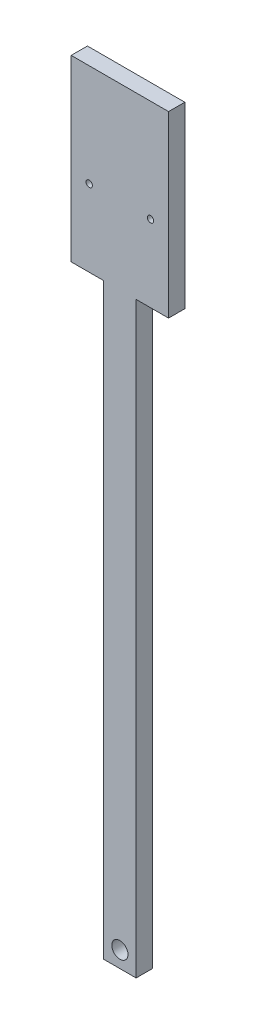
ISO-10303-21;
HEADER;
FILE_DESCRIPTION(('STEP AP214'),'2;1');
FILE_NAME('part.step','',(''),(''),'','','');
FILE_SCHEMA(('AUTOMOTIVE_DESIGN { 1 0 10303 214 1 1 1 1 }'));
ENDSEC;
DATA;
#1=APPLICATION_CONTEXT('core data for automotive mechanical design processes');
#2=APPLICATION_PROTOCOL_DEFINITION('international standard','automotive_design',2000,#1);
#3=PRODUCT_CONTEXT('',#1,'mechanical');
#4=PRODUCT('Part','Part','',(#3));
#5=PRODUCT_RELATED_PRODUCT_CATEGORY('part','',(#4));
#6=PRODUCT_DEFINITION_FORMATION('','',#4);
#7=PRODUCT_DEFINITION_CONTEXT('part definition',#1,'design');
#8=PRODUCT_DEFINITION('design','',#6,#7);
#9=PRODUCT_DEFINITION_SHAPE('','',#8);
#10=(LENGTH_UNIT() NAMED_UNIT(*) SI_UNIT(.MILLI.,.METRE.));
#11=(NAMED_UNIT(*) PLANE_ANGLE_UNIT() SI_UNIT($,.RADIAN.));
#12=(NAMED_UNIT(*) SI_UNIT($,.STERADIAN.) SOLID_ANGLE_UNIT());
#13=UNCERTAINTY_MEASURE_WITH_UNIT(LENGTH_MEASURE(1.E-05),#10,'distance_accuracy_value','');
#14=(GEOMETRIC_REPRESENTATION_CONTEXT(3) GLOBAL_UNCERTAINTY_ASSIGNED_CONTEXT((#13)) GLOBAL_UNIT_ASSIGNED_CONTEXT((#10,
#11,#12)) REPRESENTATION_CONTEXT('',''));
#15=CARTESIAN_POINT('',(0.,0.,0.));
#16=DIRECTION('',(0.,0.,1.));
#17=DIRECTION('',(1.,0.,0.));
#18=AXIS2_PLACEMENT_3D('',#15,#16,#17);
#19=CARTESIAN_POINT('',(6.35,150.,-3.175));
#20=DIRECTION('',(-1.,0.,0.));
#21=DIRECTION('',(0.,0.,1.));
#22=AXIS2_PLACEMENT_3D('',#19,#20,#21);
#23=PLANE('',#22);
#24=DIRECTION('',(0.,0.,-1.));
#25=VECTOR('',#24,1.);
#26=CARTESIAN_POINT('',(6.35,80.,-3.175));
#27=LINE('',#26,#25);
#28=CARTESIAN_POINT('',(6.35,80.,3.175));
#29=VERTEX_POINT('',#28);
#30=CARTESIAN_POINT('',(6.35,80.,-3.175));
#31=VERTEX_POINT('',#30);
#32=EDGE_CURVE('E120',#29,#31,#27,.T.);
#33=ORIENTED_EDGE('',*,*,#32,.F.);
#34=DIRECTION('',(0.,-1.,0.));
#35=VECTOR('',#34,1.);
#36=CARTESIAN_POINT('',(6.35,150.,3.175));
#37=LINE('',#36,#35);
#38=CARTESIAN_POINT('',(6.35,-150.,3.175));
#39=VERTEX_POINT('',#38);
#40=EDGE_CURVE('E49',#29,#39,#37,.T.);
#41=ORIENTED_EDGE('',*,*,#40,.T.);
#42=DIRECTION('',(0.,0.,-1.));
#43=VECTOR('',#42,1.);
#44=CARTESIAN_POINT('',(6.35,-150.,-3.175));
#45=LINE('',#44,#43);
#46=CARTESIAN_POINT('',(6.35,-150.,-3.175));
#47=VERTEX_POINT('',#46);
#48=EDGE_CURVE('E156',#39,#47,#45,.T.);
#49=ORIENTED_EDGE('',*,*,#48,.T.);
#50=DIRECTION('',(0.,-1.,0.));
#51=VECTOR('',#50,1.);
#52=CARTESIAN_POINT('',(6.35,150.,-3.175));
#53=LINE('',#52,#51);
#54=EDGE_CURVE('E11',#31,#47,#53,.T.);
#55=ORIENTED_EDGE('',*,*,#54,.F.);
#56=EDGE_LOOP('',(#33,#41,#49,#55));
#57=FACE_BOUND('',#56,.T.);
#58=ADVANCED_FACE('F35',(#57),#23,.F.);
#59=CARTESIAN_POINT('',(-6.35,150.,-3.175));
#60=DIRECTION('',(1.,0.,0.));
#61=DIRECTION('',(0.,0.,-1.));
#62=AXIS2_PLACEMENT_3D('',#59,#60,#61);
#63=PLANE('',#62);
#64=DIRECTION('',(0.,0.,1.));
#65=VECTOR('',#64,1.);
#66=CARTESIAN_POINT('',(-6.35,80.,-3.175));
#67=LINE('',#66,#65);
#68=CARTESIAN_POINT('',(-6.35,80.,-3.175));
#69=VERTEX_POINT('',#68);
#70=CARTESIAN_POINT('',(-6.35,80.,3.175));
#71=VERTEX_POINT('',#70);
#72=EDGE_CURVE('E143',#69,#71,#67,.T.);
#73=ORIENTED_EDGE('',*,*,#72,.F.);
#74=DIRECTION('',(0.,-1.,0.));
#75=VECTOR('',#74,1.);
#76=CARTESIAN_POINT('',(-6.35,150.,-3.175));
#77=LINE('',#76,#75);
#78=CARTESIAN_POINT('',(-6.35,-150.,-3.175));
#79=VERTEX_POINT('',#78);
#80=EDGE_CURVE('E42',#69,#79,#77,.T.);
#81=ORIENTED_EDGE('',*,*,#80,.T.);
#82=DIRECTION('',(0.,0.,1.));
#83=VECTOR('',#82,1.);
#84=CARTESIAN_POINT('',(-6.35,-150.,-3.175));
#85=LINE('',#84,#83);
#86=CARTESIAN_POINT('',(-6.35,-150.,3.175));
#87=VERTEX_POINT('',#86);
#88=EDGE_CURVE('E165',#79,#87,#85,.T.);
#89=ORIENTED_EDGE('',*,*,#88,.T.);
#90=DIRECTION('',(0.,-1.,0.));
#91=VECTOR('',#90,1.);
#92=CARTESIAN_POINT('',(-6.35,150.,3.175));
#93=LINE('',#92,#91);
#94=EDGE_CURVE('E56',#71,#87,#93,.T.);
#95=ORIENTED_EDGE('',*,*,#94,.F.);
#96=EDGE_LOOP('',(#73,#81,#89,#95));
#97=FACE_BOUND('',#96,.T.);
#98=ADVANCED_FACE('F172',(#97),#63,.F.);
#99=CARTESIAN_POINT('',(-6.35,150.,-3.175));
#100=DIRECTION('',(0.,0.,1.));
#101=DIRECTION('',(1.,0.,0.));
#102=AXIS2_PLACEMENT_3D('',#99,#100,#101);
#103=PLANE('',#102);
#104=CARTESIAN_POINT('',(-11.9999999999999,110.,-3.175));
#105=DIRECTION('',(0.,0.,-1.));
#106=DIRECTION('',(-1.,0.,0.));
#107=AXIS2_PLACEMENT_3D('',#104,#105,#106);
#108=CIRCLE('',#107,1.525);
#109=CARTESIAN_POINT('',(-13.5249999999999,110.,-3.175));
#110=VERTEX_POINT('',#109);
#111=EDGE_CURVE('E238',#110,#110,#108,.T.);
#112=ORIENTED_EDGE('',*,*,#111,.F.);
#113=EDGE_LOOP('',(#112));
#114=FACE_BOUND('',#113,.T.);
#115=CARTESIAN_POINT('',(12.0000000000001,110.,-3.175));
#116=DIRECTION('',(0.,0.,-1.));
#117=DIRECTION('',(-1.,0.,0.));
#118=AXIS2_PLACEMENT_3D('',#115,#116,#117);
#119=CIRCLE('',#118,1.525);
#120=CARTESIAN_POINT('',(10.4750000000001,110.,-3.175));
#121=VERTEX_POINT('',#120);
#122=EDGE_CURVE('E245',#121,#121,#119,.T.);
#123=ORIENTED_EDGE('',*,*,#122,.F.);
#124=EDGE_LOOP('',(#123));
#125=FACE_BOUND('',#124,.T.);
#126=DIRECTION('',(-1.,0.,0.));
#127=VECTOR('',#126,1.);
#128=CARTESIAN_POINT('',(-6.35,150.,-3.175));
#129=LINE('',#128,#127);
#130=CARTESIAN_POINT('',(19.05,150.,-3.175));
#131=VERTEX_POINT('',#130);
#132=CARTESIAN_POINT('',(-19.05,150.,-3.175));
#133=VERTEX_POINT('',#132);
#134=EDGE_CURVE('E108',#131,#133,#129,.T.);
#135=ORIENTED_EDGE('',*,*,#134,.F.);
#136=DIRECTION('',(0.,1.,0.));
#137=VECTOR('',#136,1.);
#138=CARTESIAN_POINT('',(19.05,80.,-3.175));
#139=LINE('',#138,#137);
#140=CARTESIAN_POINT('',(19.05,80.,-3.175));
#141=VERTEX_POINT('',#140);
#142=EDGE_CURVE('E101',#141,#131,#139,.T.);
#143=ORIENTED_EDGE('',*,*,#142,.F.);
#144=DIRECTION('',(-1.,0.,0.));
#145=VECTOR('',#144,1.);
#146=CARTESIAN_POINT('',(-19.05,80.,-3.175));
#147=LINE('',#146,#145);
#148=EDGE_CURVE('E105',#141,#31,#147,.T.);
#149=ORIENTED_EDGE('',*,*,#148,.T.);
#150=ORIENTED_EDGE('',*,*,#54,.T.);
#151=DIRECTION('',(-1.,0.,0.));
#152=VECTOR('',#151,1.);
#153=CARTESIAN_POINT('',(-6.35,-150.,-3.175));
#154=LINE('',#153,#152);
#155=EDGE_CURVE('E162',#47,#79,#154,.T.);
#156=ORIENTED_EDGE('',*,*,#155,.T.);
#157=ORIENTED_EDGE('',*,*,#80,.F.);
#158=CARTESIAN_POINT('',(-19.05,80.,-3.175));
#159=VERTEX_POINT('',#158);
#160=EDGE_CURVE('E122',#69,#159,#147,.T.);
#161=ORIENTED_EDGE('',*,*,#160,.T.);
#162=DIRECTION('',(0.,1.,0.));
#163=VECTOR('',#162,1.);
#164=CARTESIAN_POINT('',(-19.05,80.,-3.175));
#165=LINE('',#164,#163);
#166=EDGE_CURVE('E113',#159,#133,#165,.T.);
#167=ORIENTED_EDGE('',*,*,#166,.T.);
#168=EDGE_LOOP('',(#135,#143,#149,#150,#156,#157,#161,#167));
#169=FACE_BOUND('',#168,.T.);
#170=CARTESIAN_POINT('',(0.,-143.65,-3.175));
#171=DIRECTION('',(0.,0.,1.));
#172=DIRECTION('',(1.,0.,0.));
#173=AXIS2_PLACEMENT_3D('',#170,#171,#172);
#174=CIRCLE('',#173,3.175);
#175=CARTESIAN_POINT('',(3.175,-143.65,-3.175));
#176=VERTEX_POINT('',#175);
#177=EDGE_CURVE('E153',#176,#176,#174,.T.);
#178=ORIENTED_EDGE('',*,*,#177,.T.);
#179=EDGE_LOOP('',(#178));
#180=FACE_BOUND('',#179,.T.);
#181=ADVANCED_FACE('F103',(#114,#125,#169,#180),#103,.F.);
#182=CARTESIAN_POINT('',(-6.35,150.,3.175));
#183=DIRECTION('',(0.,0.,-1.));
#184=DIRECTION('',(-1.,0.,0.));
#185=AXIS2_PLACEMENT_3D('',#182,#183,#184);
#186=PLANE('',#185);
#187=CARTESIAN_POINT('',(-11.9999999999999,110.,3.175));
#188=DIRECTION('',(0.,0.,-1.));
#189=DIRECTION('',(-1.,0.,0.));
#190=AXIS2_PLACEMENT_3D('',#187,#188,#189);
#191=CIRCLE('',#190,1.25);
#192=CARTESIAN_POINT('',(-13.2499999999999,110.,3.175));
#193=VERTEX_POINT('',#192);
#194=EDGE_CURVE('E240',#193,#193,#191,.T.);
#195=ORIENTED_EDGE('',*,*,#194,.T.);
#196=EDGE_LOOP('',(#195));
#197=FACE_BOUND('',#196,.T.);
#198=CARTESIAN_POINT('',(12.0000000000001,110.,3.17500000000001));
#199=DIRECTION('',(0.,0.,-1.));
#200=DIRECTION('',(-1.,0.,0.));
#201=AXIS2_PLACEMENT_3D('',#198,#199,#200);
#202=CIRCLE('',#201,1.25);
#203=CARTESIAN_POINT('',(10.7500000000001,110.,3.17500000000001));
#204=VERTEX_POINT('',#203);
#205=EDGE_CURVE('E134',#204,#204,#202,.T.);
#206=ORIENTED_EDGE('',*,*,#205,.T.);
#207=EDGE_LOOP('',(#206));
#208=FACE_BOUND('',#207,.T.);
#209=DIRECTION('',(1.,0.,0.));
#210=VECTOR('',#209,1.);
#211=CARTESIAN_POINT('',(-6.35,150.,3.175));
#212=LINE('',#211,#210);
#213=CARTESIAN_POINT('',(-19.05,150.,3.175));
#214=VERTEX_POINT('',#213);
#215=CARTESIAN_POINT('',(19.05,150.,3.175));
#216=VERTEX_POINT('',#215);
#217=EDGE_CURVE('E158',#214,#216,#212,.T.);
#218=ORIENTED_EDGE('',*,*,#217,.F.);
#219=DIRECTION('',(0.,1.,0.));
#220=VECTOR('',#219,1.);
#221=CARTESIAN_POINT('',(-19.05,80.,3.175));
#222=LINE('',#221,#220);
#223=CARTESIAN_POINT('',(-19.05,80.,3.175));
#224=VERTEX_POINT('',#223);
#225=EDGE_CURVE('E144',#224,#214,#222,.T.);
#226=ORIENTED_EDGE('',*,*,#225,.F.);
#227=DIRECTION('',(1.,0.,0.));
#228=VECTOR('',#227,1.);
#229=CARTESIAN_POINT('',(-19.05,80.,3.175));
#230=LINE('',#229,#228);
#231=EDGE_CURVE('E114',#224,#71,#230,.T.);
#232=ORIENTED_EDGE('',*,*,#231,.T.);
#233=ORIENTED_EDGE('',*,*,#94,.T.);
#234=DIRECTION('',(1.,0.,0.));
#235=VECTOR('',#234,1.);
#236=CARTESIAN_POINT('',(-6.35,-150.,3.175));
#237=LINE('',#236,#235);
#238=EDGE_CURVE('E159',#87,#39,#237,.T.);
#239=ORIENTED_EDGE('',*,*,#238,.T.);
#240=ORIENTED_EDGE('',*,*,#40,.F.);
#241=CARTESIAN_POINT('',(19.05,80.,3.175));
#242=VERTEX_POINT('',#241);
#243=EDGE_CURVE('E139',#29,#242,#230,.T.);
#244=ORIENTED_EDGE('',*,*,#243,.T.);
#245=DIRECTION('',(0.,1.,0.));
#246=VECTOR('',#245,1.);
#247=CARTESIAN_POINT('',(19.05,80.,3.175));
#248=LINE('',#247,#246);
#249=EDGE_CURVE('E127',#242,#216,#248,.T.);
#250=ORIENTED_EDGE('',*,*,#249,.T.);
#251=EDGE_LOOP('',(#218,#226,#232,#233,#239,#240,#244,#250));
#252=FACE_BOUND('',#251,.T.);
#253=CARTESIAN_POINT('',(0.,-143.65,3.175));
#254=DIRECTION('',(0.,0.,1.));
#255=DIRECTION('',(1.,0.,0.));
#256=AXIS2_PLACEMENT_3D('',#253,#254,#255);
#257=CIRCLE('',#256,3.175);
#258=CARTESIAN_POINT('',(3.175,-143.65,3.175));
#259=VERTEX_POINT('',#258);
#260=EDGE_CURVE('E150',#259,#259,#257,.T.);
#261=ORIENTED_EDGE('',*,*,#260,.F.);
#262=EDGE_LOOP('',(#261));
#263=FACE_BOUND('',#262,.T.);
#264=ADVANCED_FACE('F179',(#197,#208,#252,#263),#186,.F.);
#265=CARTESIAN_POINT('',(0.,150.,0.));
#266=DIRECTION('',(0.,1.,0.));
#267=DIRECTION('',(0.,0.,1.));
#268=AXIS2_PLACEMENT_3D('',#265,#266,#267);
#269=PLANE('',#268);
#270=ORIENTED_EDGE('',*,*,#217,.T.);
#271=DIRECTION('',(0.,0.,-1.));
#272=VECTOR('',#271,1.);
#273=CARTESIAN_POINT('',(19.05,150.,-3.175));
#274=LINE('',#273,#272);
#275=EDGE_CURVE('E131',#216,#131,#274,.T.);
#276=ORIENTED_EDGE('',*,*,#275,.T.);
#277=ORIENTED_EDGE('',*,*,#134,.T.);
#278=DIRECTION('',(0.,0.,1.));
#279=VECTOR('',#278,1.);
#280=CARTESIAN_POINT('',(-19.05,150.,-3.175));
#281=LINE('',#280,#279);
#282=EDGE_CURVE('E128',#133,#214,#281,.T.);
#283=ORIENTED_EDGE('',*,*,#282,.T.);
#284=EDGE_LOOP('',(#270,#276,#277,#283));
#285=FACE_BOUND('',#284,.T.);
#286=ADVANCED_FACE('F195',(#285),#269,.T.);
#287=CARTESIAN_POINT('',(0.,-150.,0.));
#288=DIRECTION('',(0.,1.,0.));
#289=DIRECTION('',(0.,0.,1.));
#290=AXIS2_PLACEMENT_3D('',#287,#288,#289);
#291=PLANE('',#290);
#292=ORIENTED_EDGE('',*,*,#48,.F.);
#293=ORIENTED_EDGE('',*,*,#238,.F.);
#294=ORIENTED_EDGE('',*,*,#88,.F.);
#295=ORIENTED_EDGE('',*,*,#155,.F.);
#296=EDGE_LOOP('',(#292,#293,#294,#295));
#297=FACE_BOUND('',#296,.T.);
#298=ADVANCED_FACE('F178',(#297),#291,.F.);
#299=CARTESIAN_POINT('',(0.,-143.65,-3.175));
#300=DIRECTION('',(0.,0.,1.));
#301=DIRECTION('',(1.,0.,0.));
#302=AXIS2_PLACEMENT_3D('',#299,#300,#301);
#303=CYLINDRICAL_SURFACE('',#302,3.175);
#304=ORIENTED_EDGE('',*,*,#177,.F.);
#305=EDGE_LOOP('',(#304));
#306=FACE_BOUND('',#305,.T.);
#307=ORIENTED_EDGE('',*,*,#260,.T.);
#308=EDGE_LOOP('',(#307));
#309=FACE_BOUND('',#308,.T.);
#310=ADVANCED_FACE('F199',(#306,#309),#303,.F.);
#311=CARTESIAN_POINT('',(-19.05,80.,-3.175));
#312=DIRECTION('',(-1.,0.,0.));
#313=DIRECTION('',(0.,0.,1.));
#314=AXIS2_PLACEMENT_3D('',#311,#312,#313);
#315=PLANE('',#314);
#316=ORIENTED_EDGE('',*,*,#282,.F.);
#317=ORIENTED_EDGE('',*,*,#166,.F.);
#318=DIRECTION('',(0.,0.,1.));
#319=VECTOR('',#318,1.);
#320=CARTESIAN_POINT('',(-19.05,80.,-3.175));
#321=LINE('',#320,#319);
#322=EDGE_CURVE('E121',#159,#224,#321,.T.);
#323=ORIENTED_EDGE('',*,*,#322,.T.);
#324=ORIENTED_EDGE('',*,*,#225,.T.);
#325=EDGE_LOOP('',(#316,#317,#323,#324));
#326=FACE_BOUND('',#325,.T.);
#327=ADVANCED_FACE('F205',(#326),#315,.T.);
#328=CARTESIAN_POINT('',(0.,80.,0.));
#329=DIRECTION('',(0.,1.,0.));
#330=DIRECTION('',(0.,0.,1.));
#331=AXIS2_PLACEMENT_3D('',#328,#329,#330);
#332=PLANE('',#331);
#333=ORIENTED_EDGE('',*,*,#160,.F.);
#334=ORIENTED_EDGE('',*,*,#72,.T.);
#335=ORIENTED_EDGE('',*,*,#231,.F.);
#336=ORIENTED_EDGE('',*,*,#322,.F.);
#337=EDGE_LOOP('',(#333,#334,#335,#336));
#338=FACE_BOUND('',#337,.T.);
#339=ADVANCED_FACE('F212',(#338),#332,.F.);
#340=ORIENTED_EDGE('',*,*,#243,.F.);
#341=ORIENTED_EDGE('',*,*,#32,.T.);
#342=ORIENTED_EDGE('',*,*,#148,.F.);
#343=DIRECTION('',(0.,0.,-1.));
#344=VECTOR('',#343,1.);
#345=CARTESIAN_POINT('',(19.05,80.,-3.175));
#346=LINE('',#345,#344);
#347=EDGE_CURVE('E119',#242,#141,#346,.T.);
#348=ORIENTED_EDGE('',*,*,#347,.F.);
#349=EDGE_LOOP('',(#340,#341,#342,#348));
#350=FACE_BOUND('',#349,.T.);
#351=ADVANCED_FACE('F118',(#350),#332,.F.);
#352=CARTESIAN_POINT('',(19.05,80.,-3.175));
#353=DIRECTION('',(1.,0.,0.));
#354=DIRECTION('',(0.,0.,-1.));
#355=AXIS2_PLACEMENT_3D('',#352,#353,#354);
#356=PLANE('',#355);
#357=ORIENTED_EDGE('',*,*,#275,.F.);
#358=ORIENTED_EDGE('',*,*,#249,.F.);
#359=ORIENTED_EDGE('',*,*,#347,.T.);
#360=ORIENTED_EDGE('',*,*,#142,.T.);
#361=EDGE_LOOP('',(#357,#358,#359,#360));
#362=FACE_BOUND('',#361,.T.);
#363=ADVANCED_FACE('F125',(#362),#356,.T.);
#364=CARTESIAN_POINT('',(12.0000000000001,110.,-3.175));
#365=DIRECTION('',(0.,0.,-1.));
#366=DIRECTION('',(-1.,0.,0.));
#367=AXIS2_PLACEMENT_3D('',#364,#365,#366);
#368=CYLINDRICAL_SURFACE('',#367,1.25);
#369=ORIENTED_EDGE('',*,*,#205,.F.);
#370=EDGE_LOOP('',(#369));
#371=FACE_BOUND('',#370,.T.);
#372=CARTESIAN_POINT('',(12.0000000000001,110.,-2.9));
#373=DIRECTION('',(0.,0.,-1.));
#374=DIRECTION('',(-1.,0.,0.));
#375=AXIS2_PLACEMENT_3D('',#372,#373,#374);
#376=CIRCLE('',#375,1.25);
#377=CARTESIAN_POINT('',(10.7500000000001,110.,-2.9));
#378=VERTEX_POINT('',#377);
#379=EDGE_CURVE('E247',#378,#378,#376,.T.);
#380=ORIENTED_EDGE('',*,*,#379,.T.);
#381=EDGE_LOOP('',(#380));
#382=FACE_BOUND('',#381,.T.);
#383=ADVANCED_FACE('F209',(#371,#382),#368,.F.);
#384=CARTESIAN_POINT('',(12.0000000000001,110.,-3.175));
#385=DIRECTION('',(0.,0.,-1.));
#386=DIRECTION('',(-1.,0.,0.));
#387=AXIS2_PLACEMENT_3D('',#384,#385,#386);
#388=CONICAL_SURFACE('',#387,1.525,0.785398163397451);
#389=ORIENTED_EDGE('',*,*,#379,.F.);
#390=EDGE_LOOP('',(#389));
#391=FACE_BOUND('',#390,.T.);
#392=ORIENTED_EDGE('',*,*,#122,.T.);
#393=EDGE_LOOP('',(#392));
#394=FACE_BOUND('',#393,.T.);
#395=ADVANCED_FACE('F218',(#391,#394),#388,.F.);
#396=CARTESIAN_POINT('',(-11.9999999999999,110.,-3.175));
#397=DIRECTION('',(0.,0.,-1.));
#398=DIRECTION('',(-1.,0.,0.));
#399=AXIS2_PLACEMENT_3D('',#396,#397,#398);
#400=CYLINDRICAL_SURFACE('',#399,1.25);
#401=ORIENTED_EDGE('',*,*,#194,.F.);
#402=EDGE_LOOP('',(#401));
#403=FACE_BOUND('',#402,.T.);
#404=CARTESIAN_POINT('',(-11.9999999999999,110.,-2.9));
#405=DIRECTION('',(0.,0.,-1.));
#406=DIRECTION('',(-1.,0.,0.));
#407=AXIS2_PLACEMENT_3D('',#404,#405,#406);
#408=CIRCLE('',#407,1.25);
#409=CARTESIAN_POINT('',(-13.2499999999999,110.,-2.9));
#410=VERTEX_POINT('',#409);
#411=EDGE_CURVE('E235',#410,#410,#408,.T.);
#412=ORIENTED_EDGE('',*,*,#411,.T.);
#413=EDGE_LOOP('',(#412));
#414=FACE_BOUND('',#413,.T.);
#415=ADVANCED_FACE('F222',(#403,#414),#400,.F.);
#416=CARTESIAN_POINT('',(-11.9999999999999,110.,-3.175));
#417=DIRECTION('',(0.,0.,-1.));
#418=DIRECTION('',(-1.,0.,0.));
#419=AXIS2_PLACEMENT_3D('',#416,#417,#418);
#420=CONICAL_SURFACE('',#419,1.525,0.785398163397451);
#421=ORIENTED_EDGE('',*,*,#411,.F.);
#422=EDGE_LOOP('',(#421));
#423=FACE_BOUND('',#422,.T.);
#424=ORIENTED_EDGE('',*,*,#111,.T.);
#425=EDGE_LOOP('',(#424));
#426=FACE_BOUND('',#425,.T.);
#427=ADVANCED_FACE('F226',(#423,#426),#420,.F.);
#428=CLOSED_SHELL('',(#58,#98,#181,#264,#286,#298,#310,#327,#339,#351,#363,#383,#395,#415,#427));
#429=MANIFOLD_SOLID_BREP('B2',#428);
#430=ADVANCED_BREP_SHAPE_REPRESENTATION('',(#18,#429),#14);
#431=SHAPE_DEFINITION_REPRESENTATION(#9,#430);
ENDSEC;
END-ISO-10303-21;
